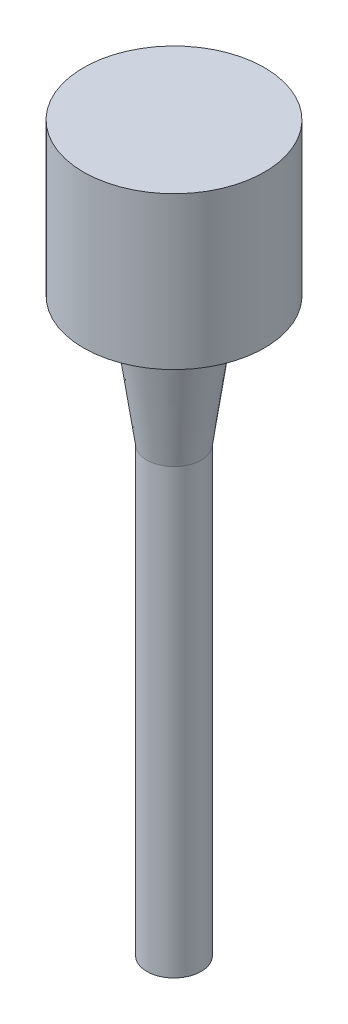
ISO-10303-21;
HEADER;
FILE_DESCRIPTION(('STEP AP214'),'2;1');
FILE_NAME('part.step','',(''),(''),'','','');
FILE_SCHEMA(('AUTOMOTIVE_DESIGN { 1 0 10303 214 1 1 1 1 }'));
ENDSEC;
DATA;
#1=APPLICATION_CONTEXT('core data for automotive mechanical design processes');
#2=APPLICATION_PROTOCOL_DEFINITION('international standard','automotive_design',2000,#1);
#3=PRODUCT_CONTEXT('',#1,'mechanical');
#4=PRODUCT('Part','Part','',(#3));
#5=PRODUCT_RELATED_PRODUCT_CATEGORY('part','',(#4));
#6=PRODUCT_DEFINITION_FORMATION('','',#4);
#7=PRODUCT_DEFINITION_CONTEXT('part definition',#1,'design');
#8=PRODUCT_DEFINITION('design','',#6,#7);
#9=PRODUCT_DEFINITION_SHAPE('','',#8);
#10=(LENGTH_UNIT() NAMED_UNIT(*) SI_UNIT(.MILLI.,.METRE.));
#11=(NAMED_UNIT(*) PLANE_ANGLE_UNIT() SI_UNIT($,.RADIAN.));
#12=(NAMED_UNIT(*) SI_UNIT($,.STERADIAN.) SOLID_ANGLE_UNIT());
#13=UNCERTAINTY_MEASURE_WITH_UNIT(LENGTH_MEASURE(1.E-05),#10,'distance_accuracy_value','');
#14=(GEOMETRIC_REPRESENTATION_CONTEXT(3) GLOBAL_UNCERTAINTY_ASSIGNED_CONTEXT((#13)) GLOBAL_UNIT_ASSIGNED_CONTEXT((#10,
#11,#12)) REPRESENTATION_CONTEXT('',''));
#15=CARTESIAN_POINT('',(0.,0.,0.));
#16=DIRECTION('',(0.,0.,1.));
#17=DIRECTION('',(1.,0.,0.));
#18=AXIS2_PLACEMENT_3D('',#15,#16,#17);
#19=CARTESIAN_POINT('',(0.,40.,0.));
#20=DIRECTION('',(0.,-1.,0.));
#21=DIRECTION('',(0.,0.,-1.));
#22=AXIS2_PLACEMENT_3D('',#19,#20,#21);
#23=CYLINDRICAL_SURFACE('',#22,5.);
#24=CARTESIAN_POINT('',(0.,31.5836477965032,0.));
#25=DIRECTION('',(0.,1.,0.));
#26=DIRECTION('',(0.,0.,1.));
#27=AXIS2_PLACEMENT_3D('',#24,#25,#26);
#28=CIRCLE('',#27,5.);
#29=CARTESIAN_POINT('',(0.,31.5836477965032,5.));
#30=VERTEX_POINT('',#29);
#31=EDGE_CURVE('E37',#30,#30,#28,.T.);
#32=ORIENTED_EDGE('',*,*,#31,.T.);
#33=EDGE_LOOP('',(#32));
#34=FACE_BOUND('',#33,.T.);
#35=CARTESIAN_POINT('',(0.,40.,0.));
#36=DIRECTION('',(0.,1.,0.));
#37=DIRECTION('',(0.,0.,1.));
#38=AXIS2_PLACEMENT_3D('',#35,#36,#37);
#39=CIRCLE('',#38,5.);
#40=CARTESIAN_POINT('',(0.,40.,5.));
#41=VERTEX_POINT('',#40);
#42=EDGE_CURVE('E41',#41,#41,#39,.T.);
#43=ORIENTED_EDGE('',*,*,#42,.F.);
#44=EDGE_LOOP('',(#43));
#45=FACE_BOUND('',#44,.T.);
#46=ADVANCED_FACE('F33',(#34,#45),#23,.T.);
#47=CARTESIAN_POINT('',(0.,40.,0.));
#48=DIRECTION('',(0.,1.,0.));
#49=DIRECTION('',(0.,0.,1.));
#50=AXIS2_PLACEMENT_3D('',#47,#48,#49);
#51=PLANE('',#50);
#52=ORIENTED_EDGE('',*,*,#42,.T.);
#53=EDGE_LOOP('',(#52));
#54=FACE_BOUND('',#53,.T.);
#55=ADVANCED_FACE('F63',(#54),#51,.T.);
#56=CARTESIAN_POINT('',(-2.5,31.5836477965032,0.));
#57=DIRECTION('',(0.,1.,0.));
#58=DIRECTION('',(0.,0.,1.));
#59=AXIS2_PLACEMENT_3D('',#56,#57,#58);
#60=PLANE('',#59);
#61=CARTESIAN_POINT('',(0.,31.5836477965032,0.));
#62=DIRECTION('',(0.,1.,0.));
#63=DIRECTION('',(0.,0.,1.));
#64=AXIS2_PLACEMENT_3D('',#61,#62,#63);
#65=CIRCLE('',#64,2.5);
#66=CARTESIAN_POINT('',(0.,31.5836477965032,2.5));
#67=VERTEX_POINT('',#66);
#68=EDGE_CURVE('E47',#67,#67,#65,.T.);
#69=ORIENTED_EDGE('',*,*,#68,.T.);
#70=EDGE_LOOP('',(#69));
#71=FACE_BOUND('',#70,.T.);
#72=ORIENTED_EDGE('',*,*,#31,.F.);
#73=EDGE_LOOP('',(#72));
#74=FACE_BOUND('',#73,.T.);
#75=ADVANCED_FACE('F69',(#71,#74),#60,.F.);
#76=CARTESIAN_POINT('',(0.,24.4682780741187,0.));
#77=DIRECTION('',(0.,1.,0.));
#78=DIRECTION('',(0.,0.,1.));
#79=AXIS2_PLACEMENT_3D('',#76,#77,#78);
#80=CONICAL_SURFACE('',#79,1.5,0.13962634015954);
#81=ORIENTED_EDGE('',*,*,#68,.F.);
#82=EDGE_LOOP('',(#81));
#83=FACE_BOUND('',#82,.T.);
#84=CARTESIAN_POINT('',(0.,24.4682780741187,0.));
#85=DIRECTION('',(0.,1.,0.));
#86=DIRECTION('',(0.,0.,1.));
#87=AXIS2_PLACEMENT_3D('',#84,#85,#86);
#88=CIRCLE('',#87,1.5);
#89=CARTESIAN_POINT('',(0.,24.4682780741187,1.5));
#90=VERTEX_POINT('',#89);
#91=EDGE_CURVE('E50',#90,#90,#88,.T.);
#92=ORIENTED_EDGE('',*,*,#91,.T.);
#93=EDGE_LOOP('',(#92));
#94=FACE_BOUND('',#93,.T.);
#95=ADVANCED_FACE('F54',(#83,#94),#80,.T.);
#96=CARTESIAN_POINT('',(0.,0.,0.));
#97=DIRECTION('',(0.,1.,0.));
#98=DIRECTION('',(0.,0.,1.));
#99=AXIS2_PLACEMENT_3D('',#96,#97,#98);
#100=PLANE('',#99);
#101=CARTESIAN_POINT('',(0.,0.,0.));
#102=DIRECTION('',(0.,1.,0.));
#103=DIRECTION('',(0.,0.,1.));
#104=AXIS2_PLACEMENT_3D('',#101,#102,#103);
#105=CIRCLE('',#104,1.5);
#106=CARTESIAN_POINT('',(0.,0.,1.5));
#107=VERTEX_POINT('',#106);
#108=EDGE_CURVE('E10',#107,#107,#105,.T.);
#109=ORIENTED_EDGE('',*,*,#108,.F.);
#110=EDGE_LOOP('',(#109));
#111=FACE_BOUND('',#110,.T.);
#112=ADVANCED_FACE('F57',(#111),#100,.F.);
#113=CARTESIAN_POINT('',(0.,10.,0.));
#114=DIRECTION('',(0.,-1.,0.));
#115=DIRECTION('',(0.,0.,-1.));
#116=AXIS2_PLACEMENT_3D('',#113,#114,#115);
#117=CYLINDRICAL_SURFACE('',#116,1.5);
#118=ORIENTED_EDGE('',*,*,#108,.T.);
#119=EDGE_LOOP('',(#118));
#120=FACE_BOUND('',#119,.T.);
#121=ORIENTED_EDGE('',*,*,#91,.F.);
#122=EDGE_LOOP('',(#121));
#123=FACE_BOUND('',#122,.T.);
#124=ADVANCED_FACE('F35',(#120,#123),#117,.T.);
#125=CLOSED_SHELL('',(#46,#55,#75,#95,#112,#124));
#126=MANIFOLD_SOLID_BREP('B2',#125);
#127=ADVANCED_BREP_SHAPE_REPRESENTATION('',(#18,#126),#14);
#128=SHAPE_DEFINITION_REPRESENTATION(#9,#127);
ENDSEC;
END-ISO-10303-21;
